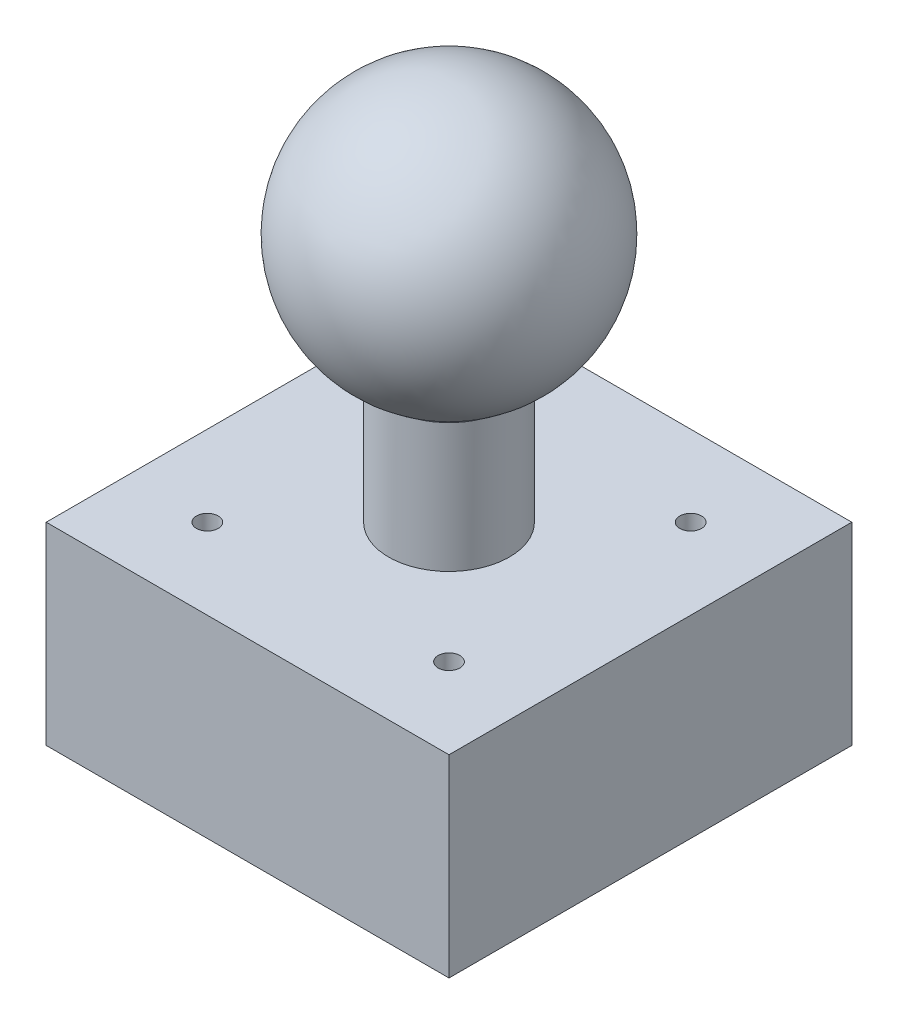
ISO-10303-21;
HEADER;
FILE_DESCRIPTION(('STEP AP214'),'2;1');
FILE_NAME('part.step','',(''),(''),'','','');
FILE_SCHEMA(('AUTOMOTIVE_DESIGN { 1 0 10303 214 1 1 1 1 }'));
ENDSEC;
DATA;
#1=APPLICATION_CONTEXT('core data for automotive mechanical design processes');
#2=APPLICATION_PROTOCOL_DEFINITION('international standard','automotive_design',2000,#1);
#3=PRODUCT_CONTEXT('',#1,'mechanical');
#4=PRODUCT('Part','Part','',(#3));
#5=PRODUCT_RELATED_PRODUCT_CATEGORY('part','',(#4));
#6=PRODUCT_DEFINITION_FORMATION('','',#4);
#7=PRODUCT_DEFINITION_CONTEXT('part definition',#1,'design');
#8=PRODUCT_DEFINITION('design','',#6,#7);
#9=PRODUCT_DEFINITION_SHAPE('','',#8);
#10=(LENGTH_UNIT() NAMED_UNIT(*) SI_UNIT(.MILLI.,.METRE.));
#11=(NAMED_UNIT(*) PLANE_ANGLE_UNIT() SI_UNIT($,.RADIAN.));
#12=(NAMED_UNIT(*) SI_UNIT($,.STERADIAN.) SOLID_ANGLE_UNIT());
#13=UNCERTAINTY_MEASURE_WITH_UNIT(LENGTH_MEASURE(1.E-05),#10,'distance_accuracy_value','');
#14=(GEOMETRIC_REPRESENTATION_CONTEXT(3) GLOBAL_UNCERTAINTY_ASSIGNED_CONTEXT((#13)) GLOBAL_UNIT_ASSIGNED_CONTEXT((#10,
#11,#12)) REPRESENTATION_CONTEXT('',''));
#15=CARTESIAN_POINT('',(0.,0.,0.));
#16=DIRECTION('',(0.,0.,1.));
#17=DIRECTION('',(1.,0.,0.));
#18=AXIS2_PLACEMENT_3D('',#15,#16,#17);
#19=CARTESIAN_POINT('',(0.,24.,0.));
#20=DIRECTION('',(0.,-1.,0.));
#21=DIRECTION('',(0.,0.,-1.));
#22=AXIS2_PLACEMENT_3D('',#19,#20,#21);
#23=PLANE('',#22);
#24=CARTESIAN_POINT('',(0.,24.,0.));
#25=DIRECTION('',(0.,-1.,0.));
#26=DIRECTION('',(0.,0.,-1.));
#27=AXIS2_PLACEMENT_3D('',#24,#25,#26);
#28=CIRCLE('',#27,7.5);
#29=CARTESIAN_POINT('',(0.,24.,-7.5));
#30=VERTEX_POINT('',#29);
#31=EDGE_CURVE('E11',#30,#30,#28,.F.);
#32=ORIENTED_EDGE('',*,*,#31,.F.);
#33=EDGE_LOOP('',(#32));
#34=FACE_BOUND('',#33,.T.);
#35=DIRECTION('',(0.,0.,-1.));
#36=VECTOR('',#35,1.);
#37=CARTESIAN_POINT('',(25.,24.,25.));
#38=LINE('',#37,#36);
#39=CARTESIAN_POINT('',(25.,24.,25.));
#40=VERTEX_POINT('',#39);
#41=CARTESIAN_POINT('',(25.,24.,-25.));
#42=VERTEX_POINT('',#41);
#43=EDGE_CURVE('E101',#40,#42,#38,.T.);
#44=ORIENTED_EDGE('',*,*,#43,.T.);
#45=DIRECTION('',(-1.,0.,0.));
#46=VECTOR('',#45,1.);
#47=CARTESIAN_POINT('',(-25.,24.,-25.));
#48=LINE('',#47,#46);
#49=CARTESIAN_POINT('',(-25.,24.,-25.));
#50=VERTEX_POINT('',#49);
#51=EDGE_CURVE('E96',#42,#50,#48,.T.);
#52=ORIENTED_EDGE('',*,*,#51,.T.);
#53=DIRECTION('',(0.,0.,1.));
#54=VECTOR('',#53,1.);
#55=CARTESIAN_POINT('',(-25.,24.,25.));
#56=LINE('',#55,#54);
#57=CARTESIAN_POINT('',(-25.,24.,25.));
#58=VERTEX_POINT('',#57);
#59=EDGE_CURVE('E99',#50,#58,#56,.T.);
#60=ORIENTED_EDGE('',*,*,#59,.T.);
#61=DIRECTION('',(1.,0.,0.));
#62=VECTOR('',#61,1.);
#63=CARTESIAN_POINT('',(-25.,24.,25.));
#64=LINE('',#63,#62);
#65=EDGE_CURVE('E65',#58,#40,#64,.T.);
#66=ORIENTED_EDGE('',*,*,#65,.T.);
#67=EDGE_LOOP('',(#44,#52,#60,#66));
#68=FACE_BOUND('',#67,.T.);
#69=CARTESIAN_POINT('',(-15.,24.,-15.));
#70=DIRECTION('',(0.,1.,0.));
#71=DIRECTION('',(0.,0.,1.));
#72=AXIS2_PLACEMENT_3D('',#69,#70,#71);
#73=CIRCLE('',#72,1.35);
#74=CARTESIAN_POINT('',(-15.,24.,-13.65));
#75=VERTEX_POINT('',#74);
#76=EDGE_CURVE('E123',#75,#75,#73,.T.);
#77=ORIENTED_EDGE('',*,*,#76,.F.);
#78=EDGE_LOOP('',(#77));
#79=FACE_BOUND('',#78,.T.);
#80=CARTESIAN_POINT('',(15.,24.,-15.));
#81=DIRECTION('',(0.,1.,0.));
#82=DIRECTION('',(0.,0.,-1.));
#83=AXIS2_PLACEMENT_3D('',#80,#81,#82);
#84=CIRCLE('',#83,1.35);
#85=CARTESIAN_POINT('',(15.,24.,-16.35));
#86=VERTEX_POINT('',#85);
#87=EDGE_CURVE('E169',#86,#86,#84,.T.);
#88=ORIENTED_EDGE('',*,*,#87,.F.);
#89=EDGE_LOOP('',(#88));
#90=FACE_BOUND('',#89,.T.);
#91=CARTESIAN_POINT('',(-15.,24.,15.));
#92=DIRECTION('',(0.,1.,0.));
#93=DIRECTION('',(0.,0.,-1.));
#94=AXIS2_PLACEMENT_3D('',#91,#92,#93);
#95=CIRCLE('',#94,1.35);
#96=CARTESIAN_POINT('',(-15.,24.,13.65));
#97=VERTEX_POINT('',#96);
#98=EDGE_CURVE('E162',#97,#97,#95,.T.);
#99=ORIENTED_EDGE('',*,*,#98,.F.);
#100=EDGE_LOOP('',(#99));
#101=FACE_BOUND('',#100,.T.);
#102=CARTESIAN_POINT('',(15.,24.,15.));
#103=DIRECTION('',(0.,1.,0.));
#104=DIRECTION('',(0.,0.,1.));
#105=AXIS2_PLACEMENT_3D('',#102,#103,#104);
#106=CIRCLE('',#105,1.35);
#107=CARTESIAN_POINT('',(15.,24.,16.35));
#108=VERTEX_POINT('',#107);
#109=EDGE_CURVE('E151',#108,#108,#106,.T.);
#110=ORIENTED_EDGE('',*,*,#109,.F.);
#111=EDGE_LOOP('',(#110));
#112=FACE_BOUND('',#111,.T.);
#113=ADVANCED_FACE('F45',(#34,#68,#79,#90,#101,#112),#23,.F.);
#114=CARTESIAN_POINT('',(0.,0.,0.));
#115=DIRECTION('',(0.,-1.,0.));
#116=DIRECTION('',(0.,0.,-1.));
#117=AXIS2_PLACEMENT_3D('',#114,#115,#116);
#118=PLANE('',#117);
#119=CARTESIAN_POINT('',(-15.,0.,15.));
#120=DIRECTION('',(0.,1.,0.));
#121=DIRECTION('',(0.,0.,-1.));
#122=AXIS2_PLACEMENT_3D('',#119,#120,#121);
#123=CIRCLE('',#122,1.35);
#124=CARTESIAN_POINT('',(-15.,0.,13.65));
#125=VERTEX_POINT('',#124);
#126=EDGE_CURVE('E157',#125,#125,#123,.T.);
#127=ORIENTED_EDGE('',*,*,#126,.T.);
#128=EDGE_LOOP('',(#127));
#129=FACE_BOUND('',#128,.T.);
#130=CARTESIAN_POINT('',(-15.,0.,-15.));
#131=DIRECTION('',(0.,1.,0.));
#132=DIRECTION('',(0.,0.,1.));
#133=AXIS2_PLACEMENT_3D('',#130,#131,#132);
#134=CIRCLE('',#133,1.35);
#135=CARTESIAN_POINT('',(-15.,0.,-13.65));
#136=VERTEX_POINT('',#135);
#137=EDGE_CURVE('E173',#136,#136,#134,.T.);
#138=ORIENTED_EDGE('',*,*,#137,.T.);
#139=EDGE_LOOP('',(#138));
#140=FACE_BOUND('',#139,.T.);
#141=DIRECTION('',(0.,0.,-1.));
#142=VECTOR('',#141,1.);
#143=CARTESIAN_POINT('',(25.,0.,25.));
#144=LINE('',#143,#142);
#145=CARTESIAN_POINT('',(25.,0.,25.));
#146=VERTEX_POINT('',#145);
#147=CARTESIAN_POINT('',(25.,0.,-25.));
#148=VERTEX_POINT('',#147);
#149=EDGE_CURVE('E119',#146,#148,#144,.T.);
#150=ORIENTED_EDGE('',*,*,#149,.F.);
#151=DIRECTION('',(1.,0.,0.));
#152=VECTOR('',#151,1.);
#153=CARTESIAN_POINT('',(-25.,0.,25.));
#154=LINE('',#153,#152);
#155=CARTESIAN_POINT('',(-25.,0.,25.));
#156=VERTEX_POINT('',#155);
#157=EDGE_CURVE('E88',#156,#146,#154,.T.);
#158=ORIENTED_EDGE('',*,*,#157,.F.);
#159=DIRECTION('',(0.,0.,1.));
#160=VECTOR('',#159,1.);
#161=CARTESIAN_POINT('',(-25.,0.,25.));
#162=LINE('',#161,#160);
#163=CARTESIAN_POINT('',(-25.,0.,-25.));
#164=VERTEX_POINT('',#163);
#165=EDGE_CURVE('E82',#164,#156,#162,.T.);
#166=ORIENTED_EDGE('',*,*,#165,.F.);
#167=DIRECTION('',(-1.,0.,0.));
#168=VECTOR('',#167,1.);
#169=CARTESIAN_POINT('',(-25.,0.,-25.));
#170=LINE('',#169,#168);
#171=EDGE_CURVE('E107',#148,#164,#170,.T.);
#172=ORIENTED_EDGE('',*,*,#171,.F.);
#173=EDGE_LOOP('',(#150,#158,#166,#172));
#174=FACE_BOUND('',#173,.T.);
#175=CARTESIAN_POINT('',(15.,0.,-15.));
#176=DIRECTION('',(0.,1.,0.));
#177=DIRECTION('',(0.,0.,-1.));
#178=AXIS2_PLACEMENT_3D('',#175,#176,#177);
#179=CIRCLE('',#178,1.35);
#180=CARTESIAN_POINT('',(15.,0.,-16.35));
#181=VERTEX_POINT('',#180);
#182=EDGE_CURVE('E145',#181,#181,#179,.T.);
#183=ORIENTED_EDGE('',*,*,#182,.T.);
#184=EDGE_LOOP('',(#183));
#185=FACE_BOUND('',#184,.T.);
#186=CARTESIAN_POINT('',(15.,0.,15.));
#187=DIRECTION('',(0.,1.,0.));
#188=DIRECTION('',(0.,0.,1.));
#189=AXIS2_PLACEMENT_3D('',#186,#187,#188);
#190=CIRCLE('',#189,1.35);
#191=CARTESIAN_POINT('',(15.,0.,16.35));
#192=VERTEX_POINT('',#191);
#193=EDGE_CURVE('E148',#192,#192,#190,.T.);
#194=ORIENTED_EDGE('',*,*,#193,.T.);
#195=EDGE_LOOP('',(#194));
#196=FACE_BOUND('',#195,.T.);
#197=ADVANCED_FACE('F137',(#129,#140,#174,#185,#196),#118,.T.);
#198=CARTESIAN_POINT('',(25.,24.,25.));
#199=DIRECTION('',(-1.,0.,0.));
#200=DIRECTION('',(0.,0.,1.));
#201=AXIS2_PLACEMENT_3D('',#198,#199,#200);
#202=PLANE('',#201);
#203=ORIENTED_EDGE('',*,*,#149,.T.);
#204=DIRECTION('',(0.,-1.,0.));
#205=VECTOR('',#204,1.);
#206=CARTESIAN_POINT('',(25.,24.,-25.));
#207=LINE('',#206,#205);
#208=EDGE_CURVE('E56',#42,#148,#207,.T.);
#209=ORIENTED_EDGE('',*,*,#208,.F.);
#210=ORIENTED_EDGE('',*,*,#43,.F.);
#211=DIRECTION('',(0.,-1.,0.));
#212=VECTOR('',#211,1.);
#213=CARTESIAN_POINT('',(25.,24.,25.));
#214=LINE('',#213,#212);
#215=EDGE_CURVE('E115',#40,#146,#214,.T.);
#216=ORIENTED_EDGE('',*,*,#215,.T.);
#217=EDGE_LOOP('',(#203,#209,#210,#216));
#218=FACE_BOUND('',#217,.T.);
#219=ADVANCED_FACE('F47',(#218),#202,.F.);
#220=CARTESIAN_POINT('',(-25.,24.,-25.));
#221=DIRECTION('',(0.,0.,1.));
#222=DIRECTION('',(1.,0.,0.));
#223=AXIS2_PLACEMENT_3D('',#220,#221,#222);
#224=PLANE('',#223);
#225=ORIENTED_EDGE('',*,*,#171,.T.);
#226=DIRECTION('',(0.,-1.,0.));
#227=VECTOR('',#226,1.);
#228=CARTESIAN_POINT('',(-25.,24.,-25.));
#229=LINE('',#228,#227);
#230=EDGE_CURVE('E105',#50,#164,#229,.T.);
#231=ORIENTED_EDGE('',*,*,#230,.F.);
#232=ORIENTED_EDGE('',*,*,#51,.F.);
#233=ORIENTED_EDGE('',*,*,#208,.T.);
#234=EDGE_LOOP('',(#225,#231,#232,#233));
#235=FACE_BOUND('',#234,.T.);
#236=ADVANCED_FACE('F106',(#235),#224,.F.);
#237=CARTESIAN_POINT('',(-25.,24.,25.));
#238=DIRECTION('',(1.,0.,0.));
#239=DIRECTION('',(0.,0.,-1.));
#240=AXIS2_PLACEMENT_3D('',#237,#238,#239);
#241=PLANE('',#240);
#242=ORIENTED_EDGE('',*,*,#165,.T.);
#243=DIRECTION('',(0.,-1.,0.));
#244=VECTOR('',#243,1.);
#245=CARTESIAN_POINT('',(-25.,24.,25.));
#246=LINE('',#245,#244);
#247=EDGE_CURVE('E109',#58,#156,#246,.T.);
#248=ORIENTED_EDGE('',*,*,#247,.F.);
#249=ORIENTED_EDGE('',*,*,#59,.F.);
#250=ORIENTED_EDGE('',*,*,#230,.T.);
#251=EDGE_LOOP('',(#242,#248,#249,#250));
#252=FACE_BOUND('',#251,.T.);
#253=ADVANCED_FACE('F111',(#252),#241,.F.);
#254=CARTESIAN_POINT('',(-25.,24.,25.));
#255=DIRECTION('',(0.,0.,-1.));
#256=DIRECTION('',(-1.,0.,0.));
#257=AXIS2_PLACEMENT_3D('',#254,#255,#256);
#258=PLANE('',#257);
#259=ORIENTED_EDGE('',*,*,#157,.T.);
#260=ORIENTED_EDGE('',*,*,#215,.F.);
#261=ORIENTED_EDGE('',*,*,#65,.F.);
#262=ORIENTED_EDGE('',*,*,#247,.T.);
#263=EDGE_LOOP('',(#259,#260,#261,#262));
#264=FACE_BOUND('',#263,.T.);
#265=ADVANCED_FACE('F188',(#264),#258,.F.);
#266=CARTESIAN_POINT('',(-15.,24.,-15.));
#267=DIRECTION('',(0.,-1.,0.));
#268=DIRECTION('',(0.,0.,-1.));
#269=AXIS2_PLACEMENT_3D('',#266,#267,#268);
#270=CYLINDRICAL_SURFACE('',#269,1.35);
#271=ORIENTED_EDGE('',*,*,#76,.T.);
#272=EDGE_LOOP('',(#271));
#273=FACE_BOUND('',#272,.T.);
#274=ORIENTED_EDGE('',*,*,#137,.F.);
#275=EDGE_LOOP('',(#274));
#276=FACE_BOUND('',#275,.T.);
#277=ADVANCED_FACE('F185',(#273,#276),#270,.F.);
#278=CARTESIAN_POINT('',(15.,24.,-15.));
#279=DIRECTION('',(0.,-1.,0.));
#280=DIRECTION('',(0.,0.,-1.));
#281=AXIS2_PLACEMENT_3D('',#278,#279,#280);
#282=CYLINDRICAL_SURFACE('',#281,1.35);
#283=ORIENTED_EDGE('',*,*,#87,.T.);
#284=EDGE_LOOP('',(#283));
#285=FACE_BOUND('',#284,.T.);
#286=ORIENTED_EDGE('',*,*,#182,.F.);
#287=EDGE_LOOP('',(#286));
#288=FACE_BOUND('',#287,.T.);
#289=ADVANCED_FACE('F187',(#285,#288),#282,.F.);
#290=CARTESIAN_POINT('',(-15.,24.,15.));
#291=DIRECTION('',(0.,-1.,0.));
#292=DIRECTION('',(0.,0.,-1.));
#293=AXIS2_PLACEMENT_3D('',#290,#291,#292);
#294=CYLINDRICAL_SURFACE('',#293,1.35);
#295=ORIENTED_EDGE('',*,*,#98,.T.);
#296=EDGE_LOOP('',(#295));
#297=FACE_BOUND('',#296,.T.);
#298=ORIENTED_EDGE('',*,*,#126,.F.);
#299=EDGE_LOOP('',(#298));
#300=FACE_BOUND('',#299,.T.);
#301=ADVANCED_FACE('F195',(#297,#300),#294,.F.);
#302=CARTESIAN_POINT('',(15.,24.,15.));
#303=DIRECTION('',(0.,-1.,0.));
#304=DIRECTION('',(0.,0.,-1.));
#305=AXIS2_PLACEMENT_3D('',#302,#303,#304);
#306=CYLINDRICAL_SURFACE('',#305,1.35);
#307=ORIENTED_EDGE('',*,*,#109,.T.);
#308=EDGE_LOOP('',(#307));
#309=FACE_BOUND('',#308,.T.);
#310=ORIENTED_EDGE('',*,*,#193,.F.);
#311=EDGE_LOOP('',(#310));
#312=FACE_BOUND('',#311,.T.);
#313=ADVANCED_FACE('F254',(#309,#312),#306,.F.);
#314=CARTESIAN_POINT('',(0.,40.,0.));
#315=DIRECTION('',(0.,-1.,0.));
#316=DIRECTION('',(0.,0.,-1.));
#317=AXIS2_PLACEMENT_3D('',#314,#315,#316);
#318=CYLINDRICAL_SURFACE('',#317,7.5);
#319=CARTESIAN_POINT('',(0.,40.,0.));
#320=DIRECTION('',(0.,1.,0.));
#321=DIRECTION('',(0.,0.,1.));
#322=AXIS2_PLACEMENT_3D('',#319,#320,#321);
#323=CIRCLE('',#322,7.5);
#324=CARTESIAN_POINT('',(0.,40.,7.5));
#325=VERTEX_POINT('',#324);
#326=EDGE_CURVE('E152',#325,#325,#323,.T.);
#327=ORIENTED_EDGE('',*,*,#326,.F.);
#328=EDGE_LOOP('',(#327));
#329=FACE_BOUND('',#328,.T.);
#330=ORIENTED_EDGE('',*,*,#31,.T.);
#331=EDGE_LOOP('',(#330));
#332=FACE_BOUND('',#331,.T.);
#333=ADVANCED_FACE('F263',(#329,#332),#318,.T.);
#334=CARTESIAN_POINT('',(0.,40.,0.));
#335=DIRECTION('',(0.,1.,0.));
#336=DIRECTION('',(0.,0.,1.));
#337=AXIS2_PLACEMENT_3D('',#334,#335,#336);
#338=PLANE('',#337);
#339=CARTESIAN_POINT('',(0.,40.,0.));
#340=DIRECTION('',(0.,1.,0.));
#341=DIRECTION('',(0.,0.,1.));
#342=AXIS2_PLACEMENT_3D('',#339,#340,#341);
#343=CIRCLE('',#342,6.87386354243376);
#344=CARTESIAN_POINT('',(0.,40.,6.87386354243376));
#345=VERTEX_POINT('',#344);
#346=EDGE_CURVE('E49',#345,#345,#343,.F.);
#347=ORIENTED_EDGE('',*,*,#346,.T.);
#348=EDGE_LOOP('',(#347));
#349=FACE_BOUND('',#348,.T.);
#350=ORIENTED_EDGE('',*,*,#326,.T.);
#351=EDGE_LOOP('',(#350));
#352=FACE_BOUND('',#351,.T.);
#353=ADVANCED_FACE('F273',(#349,#352),#338,.T.);
#354=CARTESIAN_POINT('',(0.,55.,0.));
#355=DIRECTION('',(0.,0.,-1.));
#356=DIRECTION('',(1.,0.,0.));
#357=AXIS2_PLACEMENT_3D('',#354,#355,#356);
#358=SPHERICAL_SURFACE('',#357,16.5);
#359=CARTESIAN_POINT('',(0.,55.,0.));
#360=DIRECTION('',(0.,1.,0.));
#361=DIRECTION('',(0.,0.,1.));
#362=AXIS2_PLACEMENT_3D('',#359,#360,#361);
#363=SPHERICAL_SURFACE('',#362,16.5);
#364=ORIENTED_EDGE('',*,*,#346,.F.);
#365=EDGE_LOOP('',(#364));
#366=FACE_BOUND('',#365,.T.);
#367=ADVANCED_FACE('F283',(#366),#363,.T.);
#368=CLOSED_SHELL('',(#113,#197,#219,#236,#253,#265,#277,#289,#301,#313,#333,#353,#367));
#369=MANIFOLD_SOLID_BREP('B2',#368);
#370=ADVANCED_BREP_SHAPE_REPRESENTATION('',(#18,#369),#14);
#371=SHAPE_DEFINITION_REPRESENTATION(#9,#370);
ENDSEC;
END-ISO-10303-21;
